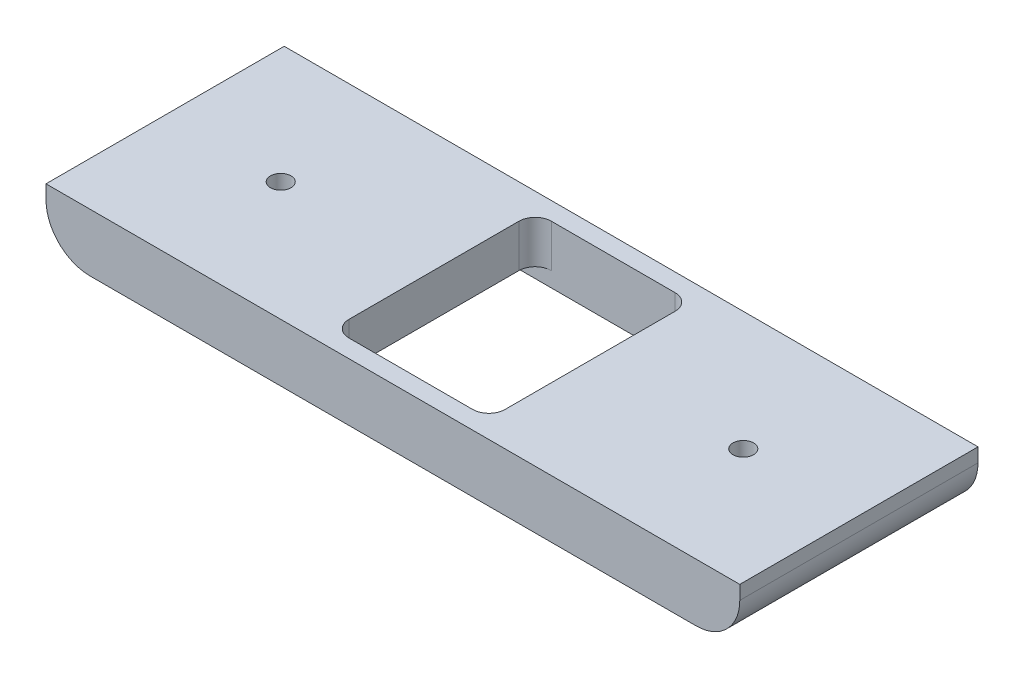
ISO-10303-21;
HEADER;
FILE_DESCRIPTION(('STEP AP214'),'2;1');
FILE_NAME('part.step','',(''),(''),'','','');
FILE_SCHEMA(('AUTOMOTIVE_DESIGN { 1 0 10303 214 1 1 1 1 }'));
ENDSEC;
DATA;
#1=APPLICATION_CONTEXT('core data for automotive mechanical design processes');
#2=APPLICATION_PROTOCOL_DEFINITION('international standard','automotive_design',2000,#1);
#3=PRODUCT_CONTEXT('',#1,'mechanical');
#4=PRODUCT('Part','Part','',(#3));
#5=PRODUCT_RELATED_PRODUCT_CATEGORY('part','',(#4));
#6=PRODUCT_DEFINITION_FORMATION('','',#4);
#7=PRODUCT_DEFINITION_CONTEXT('part definition',#1,'design');
#8=PRODUCT_DEFINITION('design','',#6,#7);
#9=PRODUCT_DEFINITION_SHAPE('','',#8);
#10=(LENGTH_UNIT() NAMED_UNIT(*) SI_UNIT(.MILLI.,.METRE.));
#11=(NAMED_UNIT(*) PLANE_ANGLE_UNIT() SI_UNIT($,.RADIAN.));
#12=(NAMED_UNIT(*) SI_UNIT($,.STERADIAN.) SOLID_ANGLE_UNIT());
#13=UNCERTAINTY_MEASURE_WITH_UNIT(LENGTH_MEASURE(1.E-05),#10,'distance_accuracy_value','');
#14=(GEOMETRIC_REPRESENTATION_CONTEXT(3) GLOBAL_UNCERTAINTY_ASSIGNED_CONTEXT((#13)) GLOBAL_UNIT_ASSIGNED_CONTEXT((#10,
#11,#12)) REPRESENTATION_CONTEXT('',''));
#15=CARTESIAN_POINT('',(0.,0.,0.));
#16=DIRECTION('',(0.,0.,1.));
#17=DIRECTION('',(1.,0.,0.));
#18=AXIS2_PLACEMENT_3D('',#15,#16,#17);
#19=CARTESIAN_POINT('',(-38.1,1.651,11.1125));
#20=DIRECTION('',(0.,1.,0.));
#21=DIRECTION('',(0.,0.,1.));
#22=AXIS2_PLACEMENT_3D('',#19,#20,#21);
#23=PLANE('',#22);
#24=CARTESIAN_POINT('',(-25.4,1.651,0.));
#25=DIRECTION('',(0.,1.,0.));
#26=DIRECTION('',(0.,0.,1.));
#27=AXIS2_PLACEMENT_3D('',#24,#25,#26);
#28=CIRCLE('',#27,1.13029999999999);
#29=CARTESIAN_POINT('',(-25.4,1.651,1.1303));
#30=VERTEX_POINT('',#29);
#31=EDGE_CURVE('E564',#30,#30,#28,.T.);
#32=ORIENTED_EDGE('',*,*,#31,.T.);
#33=EDGE_LOOP('',(#32));
#34=FACE_BOUND('',#33,.T.);
#35=DIRECTION('',(1.,0.,0.));
#36=VECTOR('',#35,1.);
#37=CARTESIAN_POINT('',(-38.1,1.651,-11.1125));
#38=LINE('',#37,#36);
#39=CARTESIAN_POINT('',(-36.9085083573986,1.651,-11.1125));
#40=VERTEX_POINT('',#39);
#41=CARTESIAN_POINT('',(-6.7945,1.651,-11.1125));
#42=VERTEX_POINT('',#41);
#43=EDGE_CURVE('E229',#40,#42,#38,.T.);
#44=ORIENTED_EDGE('',*,*,#43,.T.);
#45=CARTESIAN_POINT('',(-6.7945,1.651,-9.3345));
#46=DIRECTION('',(0.,1.,0.));
#47=DIRECTION('',(0.,0.,1.));
#48=AXIS2_PLACEMENT_3D('',#45,#46,#47);
#49=CIRCLE('',#48,1.778);
#50=CARTESIAN_POINT('',(-8.57250000000001,1.651,-9.3345));
#51=VERTEX_POINT('',#50);
#52=EDGE_CURVE('E202',#42,#51,#49,.T.);
#53=ORIENTED_EDGE('',*,*,#52,.T.);
#54=DIRECTION('',(0.,0.,1.));
#55=VECTOR('',#54,1.);
#56=CARTESIAN_POINT('',(-8.5725,1.651,11.1125));
#57=LINE('',#56,#55);
#58=CARTESIAN_POINT('',(-8.5725,1.651,9.3345));
#59=VERTEX_POINT('',#58);
#60=EDGE_CURVE('E12',#51,#59,#57,.T.);
#61=ORIENTED_EDGE('',*,*,#60,.T.);
#62=CARTESIAN_POINT('',(-6.7945,1.651,9.3345));
#63=DIRECTION('',(0.,1.,0.));
#64=DIRECTION('',(0.,0.,1.));
#65=AXIS2_PLACEMENT_3D('',#62,#63,#64);
#66=CIRCLE('',#65,1.778);
#67=CARTESIAN_POINT('',(-6.7945,1.651,11.1125));
#68=VERTEX_POINT('',#67);
#69=EDGE_CURVE('E45',#59,#68,#66,.T.);
#70=ORIENTED_EDGE('',*,*,#69,.T.);
#71=DIRECTION('',(1.,0.,0.));
#72=VECTOR('',#71,1.);
#73=CARTESIAN_POINT('',(-38.1,1.651,11.1125));
#74=LINE('',#73,#72);
#75=CARTESIAN_POINT('',(-36.9085083573986,1.651,11.1125));
#76=VERTEX_POINT('',#75);
#77=EDGE_CURVE('E225',#76,#68,#74,.T.);
#78=ORIENTED_EDGE('',*,*,#77,.F.);
#79=DIRECTION('',(0.,0.,1.));
#80=VECTOR('',#79,1.);
#81=CARTESIAN_POINT('',(-36.9085083573986,1.651,-13.081));
#82=LINE('',#81,#80);
#83=EDGE_CURVE('E293',#76,#40,#82,.F.);
#84=ORIENTED_EDGE('',*,*,#83,.T.);
#85=EDGE_LOOP('',(#44,#53,#61,#70,#78,#84));
#86=FACE_BOUND('',#85,.T.);
#87=ADVANCED_FACE('F36',(#34,#86),#23,.F.);
#88=CARTESIAN_POINT('',(38.1,0.,13.081));
#89=DIRECTION('',(0.,1.,0.));
#90=DIRECTION('',(0.,0.,1.));
#91=AXIS2_PLACEMENT_3D('',#88,#89,#90);
#92=PLANE('',#91);
#93=DIRECTION('',(0.,0.,1.));
#94=VECTOR('',#93,1.);
#95=CARTESIAN_POINT('',(-33.274,0.,13.081));
#96=LINE('',#95,#94);
#97=CARTESIAN_POINT('',(-33.274,0.,13.081));
#98=VERTEX_POINT('',#97);
#99=CARTESIAN_POINT('',(-33.274,0.,11.1125));
#100=VERTEX_POINT('',#99);
#101=EDGE_CURVE('E277',#98,#100,#96,.F.);
#102=ORIENTED_EDGE('',*,*,#101,.T.);
#103=DIRECTION('',(1.,0.,0.));
#104=VECTOR('',#103,1.);
#105=CARTESIAN_POINT('',(-38.1,0.,11.1125));
#106=LINE('',#105,#104);
#107=CARTESIAN_POINT('',(33.274,0.,11.1125));
#108=VERTEX_POINT('',#107);
#109=EDGE_CURVE('E222',#100,#108,#106,.T.);
#110=ORIENTED_EDGE('',*,*,#109,.T.);
#111=DIRECTION('',(0.,0.,-1.));
#112=VECTOR('',#111,1.);
#113=CARTESIAN_POINT('',(33.274,0.,13.081));
#114=LINE('',#113,#112);
#115=CARTESIAN_POINT('',(33.274,0.,13.081));
#116=VERTEX_POINT('',#115);
#117=EDGE_CURVE('E280',#108,#116,#114,.F.);
#118=ORIENTED_EDGE('',*,*,#117,.T.);
#119=DIRECTION('',(1.,0.,0.));
#120=VECTOR('',#119,1.);
#121=CARTESIAN_POINT('',(-38.1,0.,13.081));
#122=LINE('',#121,#120);
#123=EDGE_CURVE('E247',#98,#116,#122,.T.);
#124=ORIENTED_EDGE('',*,*,#123,.F.);
#125=EDGE_LOOP('',(#102,#110,#118,#124));
#126=FACE_BOUND('',#125,.T.);
#127=ADVANCED_FACE('F318',(#126),#92,.F.);
#128=CARTESIAN_POINT('',(38.1,6.35,-13.081));
#129=DIRECTION('',(-1.,0.,0.));
#130=DIRECTION('',(0.,0.,1.));
#131=AXIS2_PLACEMENT_3D('',#128,#129,#130);
#132=PLANE('',#131);
#133=DIRECTION('',(0.,-1.,0.));
#134=VECTOR('',#133,1.);
#135=CARTESIAN_POINT('',(38.1,6.35,13.081));
#136=LINE('',#135,#134);
#137=CARTESIAN_POINT('',(38.1,6.35,13.081));
#138=VERTEX_POINT('',#137);
#139=CARTESIAN_POINT('',(38.1,4.826,13.081));
#140=VERTEX_POINT('',#139);
#141=EDGE_CURVE('E253',#138,#140,#136,.T.);
#142=ORIENTED_EDGE('',*,*,#141,.T.);
#143=DIRECTION('',(0.,0.,-1.));
#144=VECTOR('',#143,1.);
#145=CARTESIAN_POINT('',(38.1,4.826,-13.081));
#146=LINE('',#145,#144);
#147=CARTESIAN_POINT('',(38.1,4.826,-13.081));
#148=VERTEX_POINT('',#147);
#149=EDGE_CURVE('E269',#140,#148,#146,.T.);
#150=ORIENTED_EDGE('',*,*,#149,.T.);
#151=DIRECTION('',(0.,-1.,0.));
#152=VECTOR('',#151,1.);
#153=CARTESIAN_POINT('',(38.1,6.35,-13.081));
#154=LINE('',#153,#152);
#155=CARTESIAN_POINT('',(38.1,6.35,-13.081));
#156=VERTEX_POINT('',#155);
#157=EDGE_CURVE('E266',#156,#148,#154,.T.);
#158=ORIENTED_EDGE('',*,*,#157,.F.);
#159=DIRECTION('',(0.,0.,-1.));
#160=VECTOR('',#159,1.);
#161=CARTESIAN_POINT('',(38.1,6.35,-13.081));
#162=LINE('',#161,#160);
#163=EDGE_CURVE('E243',#138,#156,#162,.T.);
#164=ORIENTED_EDGE('',*,*,#163,.F.);
#165=EDGE_LOOP('',(#142,#150,#158,#164));
#166=FACE_BOUND('',#165,.T.);
#167=ADVANCED_FACE('F331',(#166),#132,.F.);
#168=CARTESIAN_POINT('',(-38.1,6.35,-13.081));
#169=DIRECTION('',(0.,0.,1.));
#170=DIRECTION('',(1.,0.,0.));
#171=AXIS2_PLACEMENT_3D('',#168,#169,#170);
#172=PLANE('',#171);
#173=ORIENTED_EDGE('',*,*,#157,.T.);
#174=CARTESIAN_POINT('',(33.274,4.826,-13.081));
#175=DIRECTION('',(0.,0.,1.));
#176=DIRECTION('',(1.,0.,0.));
#177=AXIS2_PLACEMENT_3D('',#174,#175,#176);
#178=CIRCLE('',#177,4.826);
#179=CARTESIAN_POINT('',(33.274,0.,-13.081));
#180=VERTEX_POINT('',#179);
#181=EDGE_CURVE('E274',#148,#180,#178,.F.);
#182=ORIENTED_EDGE('',*,*,#181,.T.);
#183=DIRECTION('',(-1.,0.,0.));
#184=VECTOR('',#183,1.);
#185=CARTESIAN_POINT('',(-38.1,0.,-13.081));
#186=LINE('',#185,#184);
#187=CARTESIAN_POINT('',(-33.274,0.,-13.081));
#188=VERTEX_POINT('',#187);
#189=EDGE_CURVE('E242',#180,#188,#186,.T.);
#190=ORIENTED_EDGE('',*,*,#189,.T.);
#191=CARTESIAN_POINT('',(-33.274,4.826,-13.081));
#192=DIRECTION('',(0.,0.,1.));
#193=DIRECTION('',(1.,0.,0.));
#194=AXIS2_PLACEMENT_3D('',#191,#192,#193);
#195=CIRCLE('',#194,4.826);
#196=CARTESIAN_POINT('',(-38.1,4.826,-13.081));
#197=VERTEX_POINT('',#196);
#198=EDGE_CURVE('E272',#188,#197,#195,.F.);
#199=ORIENTED_EDGE('',*,*,#198,.T.);
#200=DIRECTION('',(0.,-1.,0.));
#201=VECTOR('',#200,1.);
#202=CARTESIAN_POINT('',(-38.1,6.35,-13.081));
#203=LINE('',#202,#201);
#204=CARTESIAN_POINT('',(-38.1,6.35,-13.081));
#205=VERTEX_POINT('',#204);
#206=EDGE_CURVE('E263',#205,#197,#203,.T.);
#207=ORIENTED_EDGE('',*,*,#206,.F.);
#208=DIRECTION('',(-1.,0.,0.));
#209=VECTOR('',#208,1.);
#210=CARTESIAN_POINT('',(-38.1,6.35,-13.081));
#211=LINE('',#210,#209);
#212=EDGE_CURVE('E246',#156,#205,#211,.T.);
#213=ORIENTED_EDGE('',*,*,#212,.F.);
#214=EDGE_LOOP('',(#173,#182,#190,#199,#207,#213));
#215=FACE_BOUND('',#214,.T.);
#216=ADVANCED_FACE('F334',(#215),#172,.F.);
#217=CARTESIAN_POINT('',(-38.1,6.35,-13.081));
#218=DIRECTION('',(1.,0.,0.));
#219=DIRECTION('',(0.,0.,-1.));
#220=AXIS2_PLACEMENT_3D('',#217,#218,#219);
#221=PLANE('',#220);
#222=ORIENTED_EDGE('',*,*,#206,.T.);
#223=DIRECTION('',(0.,0.,1.));
#224=VECTOR('',#223,1.);
#225=CARTESIAN_POINT('',(-38.1,4.826,-13.081));
#226=LINE('',#225,#224);
#227=CARTESIAN_POINT('',(-38.1,4.826,13.081));
#228=VERTEX_POINT('',#227);
#229=EDGE_CURVE('E288',#197,#228,#226,.T.);
#230=ORIENTED_EDGE('',*,*,#229,.T.);
#231=DIRECTION('',(0.,-1.,0.));
#232=VECTOR('',#231,1.);
#233=CARTESIAN_POINT('',(-38.1,6.35,13.081));
#234=LINE('',#233,#232);
#235=CARTESIAN_POINT('',(-38.1,6.35,13.081));
#236=VERTEX_POINT('',#235);
#237=EDGE_CURVE('E260',#236,#228,#234,.T.);
#238=ORIENTED_EDGE('',*,*,#237,.F.);
#239=DIRECTION('',(0.,0.,1.));
#240=VECTOR('',#239,1.);
#241=CARTESIAN_POINT('',(-38.1,6.35,-13.081));
#242=LINE('',#241,#240);
#243=EDGE_CURVE('E249',#205,#236,#242,.T.);
#244=ORIENTED_EDGE('',*,*,#243,.F.);
#245=EDGE_LOOP('',(#222,#230,#238,#244));
#246=FACE_BOUND('',#245,.T.);
#247=ADVANCED_FACE('F341',(#246),#221,.F.);
#248=CARTESIAN_POINT('',(-38.1,6.35,13.081));
#249=DIRECTION('',(0.,0.,-1.));
#250=DIRECTION('',(-1.,0.,0.));
#251=AXIS2_PLACEMENT_3D('',#248,#249,#250);
#252=PLANE('',#251);
#253=ORIENTED_EDGE('',*,*,#123,.T.);
#254=CARTESIAN_POINT('',(33.274,4.826,13.081));
#255=DIRECTION('',(0.,0.,-1.));
#256=DIRECTION('',(-1.,0.,0.));
#257=AXIS2_PLACEMENT_3D('',#254,#255,#256);
#258=CIRCLE('',#257,4.826);
#259=EDGE_CURVE('E286',#116,#140,#258,.F.);
#260=ORIENTED_EDGE('',*,*,#259,.T.);
#261=ORIENTED_EDGE('',*,*,#141,.F.);
#262=DIRECTION('',(1.,0.,0.));
#263=VECTOR('',#262,1.);
#264=CARTESIAN_POINT('',(-38.1,6.35,13.081));
#265=LINE('',#264,#263);
#266=EDGE_CURVE('E251',#236,#138,#265,.T.);
#267=ORIENTED_EDGE('',*,*,#266,.F.);
#268=ORIENTED_EDGE('',*,*,#237,.T.);
#269=CARTESIAN_POINT('',(-33.274,4.826,13.081));
#270=DIRECTION('',(0.,0.,-1.));
#271=DIRECTION('',(-1.,0.,0.));
#272=AXIS2_PLACEMENT_3D('',#269,#270,#271);
#273=CIRCLE('',#272,4.826);
#274=EDGE_CURVE('E284',#228,#98,#273,.F.);
#275=ORIENTED_EDGE('',*,*,#274,.T.);
#276=EDGE_LOOP('',(#253,#260,#261,#267,#268,#275));
#277=FACE_BOUND('',#276,.T.);
#278=ADVANCED_FACE('F322',(#277),#252,.F.);
#279=CARTESIAN_POINT('',(38.1,6.35,13.081));
#280=DIRECTION('',(0.,1.,0.));
#281=DIRECTION('',(0.,0.,1.));
#282=AXIS2_PLACEMENT_3D('',#279,#280,#281);
#283=PLANE('',#282);
#284=CARTESIAN_POINT('',(-25.4,6.35,0.));
#285=DIRECTION('',(0.,1.,0.));
#286=DIRECTION('',(0.,0.,1.));
#287=AXIS2_PLACEMENT_3D('',#284,#285,#286);
#288=CIRCLE('',#287,1.13029999999999);
#289=CARTESIAN_POINT('',(-25.4,6.35,1.13029999999999));
#290=VERTEX_POINT('',#289);
#291=EDGE_CURVE('E562',#290,#290,#288,.T.);
#292=ORIENTED_EDGE('',*,*,#291,.F.);
#293=EDGE_LOOP('',(#292));
#294=FACE_BOUND('',#293,.T.);
#295=CARTESIAN_POINT('',(25.4,6.35,0.));
#296=DIRECTION('',(0.,1.,0.));
#297=DIRECTION('',(0.,0.,1.));
#298=AXIS2_PLACEMENT_3D('',#295,#296,#297);
#299=CIRCLE('',#298,1.13029999999999);
#300=CARTESIAN_POINT('',(25.4,6.35,1.13029999999999));
#301=VERTEX_POINT('',#300);
#302=EDGE_CURVE('E183',#301,#301,#299,.T.);
#303=ORIENTED_EDGE('',*,*,#302,.F.);
#304=EDGE_LOOP('',(#303));
#305=FACE_BOUND('',#304,.T.);
#306=CARTESIAN_POINT('',(6.7945,6.35,-9.3345));
#307=DIRECTION('',(0.,-1.,0.));
#308=DIRECTION('',(0.,0.,-1.));
#309=AXIS2_PLACEMENT_3D('',#306,#307,#308);
#310=CIRCLE('',#309,1.778);
#311=CARTESIAN_POINT('',(6.7945,6.35,-11.1125));
#312=VERTEX_POINT('',#311);
#313=CARTESIAN_POINT('',(8.5725,6.35,-9.3345));
#314=VERTEX_POINT('',#313);
#315=EDGE_CURVE('E164',#312,#314,#310,.T.);
#316=ORIENTED_EDGE('',*,*,#315,.T.);
#317=DIRECTION('',(0.,0.,1.));
#318=VECTOR('',#317,1.);
#319=CARTESIAN_POINT('',(8.5725,6.35,9.3345));
#320=LINE('',#319,#318);
#321=CARTESIAN_POINT('',(8.5725,6.35,9.3345));
#322=VERTEX_POINT('',#321);
#323=EDGE_CURVE('E173',#314,#322,#320,.T.);
#324=ORIENTED_EDGE('',*,*,#323,.T.);
#325=CARTESIAN_POINT('',(6.7945,6.35,9.3345));
#326=DIRECTION('',(0.,-1.,0.));
#327=DIRECTION('',(0.,0.,-1.));
#328=AXIS2_PLACEMENT_3D('',#325,#326,#327);
#329=CIRCLE('',#328,1.778);
#330=CARTESIAN_POINT('',(6.7945,6.35,11.1125));
#331=VERTEX_POINT('',#330);
#332=EDGE_CURVE('E52',#322,#331,#329,.T.);
#333=ORIENTED_EDGE('',*,*,#332,.T.);
#334=DIRECTION('',(-1.,0.,0.));
#335=VECTOR('',#334,1.);
#336=CARTESIAN_POINT('',(-6.7945,6.35,11.1125));
#337=LINE('',#336,#335);
#338=CARTESIAN_POINT('',(-6.7945,6.35,11.1125));
#339=VERTEX_POINT('',#338);
#340=EDGE_CURVE('E188',#331,#339,#337,.T.);
#341=ORIENTED_EDGE('',*,*,#340,.T.);
#342=CARTESIAN_POINT('',(-6.7945,6.35,9.3345));
#343=DIRECTION('',(0.,-1.,0.));
#344=DIRECTION('',(0.,0.,-1.));
#345=AXIS2_PLACEMENT_3D('',#342,#343,#344);
#346=CIRCLE('',#345,1.778);
#347=CARTESIAN_POINT('',(-8.5725,6.35,9.3345));
#348=VERTEX_POINT('',#347);
#349=EDGE_CURVE('E191',#339,#348,#346,.T.);
#350=ORIENTED_EDGE('',*,*,#349,.T.);
#351=DIRECTION('',(0.,0.,-1.));
#352=VECTOR('',#351,1.);
#353=CARTESIAN_POINT('',(-8.5725,6.35,-9.3345));
#354=LINE('',#353,#352);
#355=CARTESIAN_POINT('',(-8.57250000000001,6.35,-9.3345));
#356=VERTEX_POINT('',#355);
#357=EDGE_CURVE('E194',#348,#356,#354,.T.);
#358=ORIENTED_EDGE('',*,*,#357,.T.);
#359=CARTESIAN_POINT('',(-6.7945,6.35,-9.3345));
#360=DIRECTION('',(0.,-1.,0.));
#361=DIRECTION('',(0.,0.,-1.));
#362=AXIS2_PLACEMENT_3D('',#359,#360,#361);
#363=CIRCLE('',#362,1.778);
#364=CARTESIAN_POINT('',(-6.7945,6.35,-11.1125));
#365=VERTEX_POINT('',#364);
#366=EDGE_CURVE('E197',#356,#365,#363,.T.);
#367=ORIENTED_EDGE('',*,*,#366,.T.);
#368=DIRECTION('',(1.,0.,0.));
#369=VECTOR('',#368,1.);
#370=CARTESIAN_POINT('',(6.7945,6.35,-11.1125));
#371=LINE('',#370,#369);
#372=EDGE_CURVE('E170',#365,#312,#371,.T.);
#373=ORIENTED_EDGE('',*,*,#372,.T.);
#374=EDGE_LOOP('',(#316,#324,#333,#341,#350,#358,#367,#373));
#375=FACE_BOUND('',#374,.T.);
#376=ORIENTED_EDGE('',*,*,#163,.T.);
#377=ORIENTED_EDGE('',*,*,#212,.T.);
#378=ORIENTED_EDGE('',*,*,#243,.T.);
#379=ORIENTED_EDGE('',*,*,#266,.T.);
#380=EDGE_LOOP('',(#376,#377,#378,#379));
#381=FACE_BOUND('',#380,.T.);
#382=ADVANCED_FACE('F177',(#294,#305,#375,#381),#283,.T.);
#383=CARTESIAN_POINT('',(33.274,0.,-11.1125));
#384=VERTEX_POINT('',#383);
#385=EDGE_CURVE('E281',#180,#384,#114,.F.);
#386=ORIENTED_EDGE('',*,*,#385,.T.);
#387=DIRECTION('',(1.,0.,0.));
#388=VECTOR('',#387,1.);
#389=CARTESIAN_POINT('',(-38.1,0.,-11.1125));
#390=LINE('',#389,#388);
#391=CARTESIAN_POINT('',(-33.274,0.,-11.1125));
#392=VERTEX_POINT('',#391);
#393=EDGE_CURVE('E221',#392,#384,#390,.T.);
#394=ORIENTED_EDGE('',*,*,#393,.F.);
#395=EDGE_CURVE('E276',#392,#188,#96,.F.);
#396=ORIENTED_EDGE('',*,*,#395,.T.);
#397=ORIENTED_EDGE('',*,*,#189,.F.);
#398=EDGE_LOOP('',(#386,#394,#396,#397));
#399=FACE_BOUND('',#398,.T.);
#400=ADVANCED_FACE('F346',(#399),#92,.F.);
#401=CARTESIAN_POINT('',(33.274,4.826,-13.081));
#402=DIRECTION('',(0.,0.,-1.));
#403=DIRECTION('',(-1.,0.,0.));
#404=AXIS2_PLACEMENT_3D('',#401,#402,#403);
#405=CYLINDRICAL_SURFACE('',#404,4.826);
#406=CARTESIAN_POINT('',(33.274,4.826,11.1125));
#407=DIRECTION('',(0.,0.,1.));
#408=DIRECTION('',(0.,-1.,0.));
#409=AXIS2_PLACEMENT_3D('',#406,#407,#408);
#410=CIRCLE('',#409,4.826);
#411=CARTESIAN_POINT('',(36.9085083573985,1.651,11.1125));
#412=VERTEX_POINT('',#411);
#413=EDGE_CURVE('E239',#412,#108,#410,.F.);
#414=ORIENTED_EDGE('',*,*,#413,.F.);
#415=DIRECTION('',(0.,0.,-1.));
#416=VECTOR('',#415,1.);
#417=CARTESIAN_POINT('',(36.9085083573986,1.651,-13.081));
#418=LINE('',#417,#416);
#419=CARTESIAN_POINT('',(36.9085083573986,1.651,-11.1125));
#420=VERTEX_POINT('',#419);
#421=EDGE_CURVE('E236',#420,#412,#418,.F.);
#422=ORIENTED_EDGE('',*,*,#421,.F.);
#423=CARTESIAN_POINT('',(33.274,4.826,-11.1125));
#424=DIRECTION('',(0.,0.,-1.));
#425=DIRECTION('',(0.,1.,0.));
#426=AXIS2_PLACEMENT_3D('',#423,#424,#425);
#427=CIRCLE('',#426,4.826);
#428=EDGE_CURVE('E224',#384,#420,#427,.F.);
#429=ORIENTED_EDGE('',*,*,#428,.F.);
#430=ORIENTED_EDGE('',*,*,#385,.F.);
#431=ORIENTED_EDGE('',*,*,#181,.F.);
#432=ORIENTED_EDGE('',*,*,#149,.F.);
#433=ORIENTED_EDGE('',*,*,#259,.F.);
#434=ORIENTED_EDGE('',*,*,#117,.F.);
#435=EDGE_LOOP('',(#414,#422,#429,#430,#431,#432,#433,#434));
#436=FACE_BOUND('',#435,.T.);
#437=ADVANCED_FACE('F327',(#436),#405,.T.);
#438=CARTESIAN_POINT('',(-33.274,4.826,-13.081));
#439=DIRECTION('',(0.,0.,1.));
#440=DIRECTION('',(1.,0.,0.));
#441=AXIS2_PLACEMENT_3D('',#438,#439,#440);
#442=CYLINDRICAL_SURFACE('',#441,4.826);
#443=CARTESIAN_POINT('',(-33.274,4.826,11.1125));
#444=DIRECTION('',(0.,0.,1.));
#445=DIRECTION('',(0.,-1.,0.));
#446=AXIS2_PLACEMENT_3D('',#443,#444,#445);
#447=CIRCLE('',#446,4.826);
#448=EDGE_CURVE('E296',#100,#76,#447,.F.);
#449=ORIENTED_EDGE('',*,*,#448,.F.);
#450=ORIENTED_EDGE('',*,*,#101,.F.);
#451=ORIENTED_EDGE('',*,*,#274,.F.);
#452=ORIENTED_EDGE('',*,*,#229,.F.);
#453=ORIENTED_EDGE('',*,*,#198,.F.);
#454=ORIENTED_EDGE('',*,*,#395,.F.);
#455=CARTESIAN_POINT('',(-33.274,4.826,-11.1125));
#456=DIRECTION('',(0.,0.,-1.));
#457=DIRECTION('',(0.,1.,0.));
#458=AXIS2_PLACEMENT_3D('',#455,#456,#457);
#459=CIRCLE('',#458,4.826);
#460=EDGE_CURVE('E291',#40,#392,#459,.F.);
#461=ORIENTED_EDGE('',*,*,#460,.F.);
#462=ORIENTED_EDGE('',*,*,#83,.F.);
#463=EDGE_LOOP('',(#449,#450,#451,#452,#453,#454,#461,#462));
#464=FACE_BOUND('',#463,.T.);
#465=ADVANCED_FACE('F38',(#464),#442,.T.);
#466=CARTESIAN_POINT('',(-38.1,0.,11.1125));
#467=DIRECTION('',(0.,0.,1.));
#468=DIRECTION('',(0.,-1.,0.));
#469=AXIS2_PLACEMENT_3D('',#466,#467,#468);
#470=PLANE('',#469);
#471=ORIENTED_EDGE('',*,*,#77,.T.);
#472=DIRECTION('',(0.,-1.,0.));
#473=VECTOR('',#472,1.);
#474=CARTESIAN_POINT('',(-6.7945,6.35,11.1125));
#475=LINE('',#474,#473);
#476=EDGE_CURVE('E212',#339,#68,#475,.T.);
#477=ORIENTED_EDGE('',*,*,#476,.F.);
#478=ORIENTED_EDGE('',*,*,#340,.F.);
#479=DIRECTION('',(0.,-1.,0.));
#480=VECTOR('',#479,1.);
#481=CARTESIAN_POINT('',(6.7945,6.35,11.1125));
#482=LINE('',#481,#480);
#483=CARTESIAN_POINT('',(6.7945,1.651,11.1125));
#484=VERTEX_POINT('',#483);
#485=EDGE_CURVE('E214',#331,#484,#482,.T.);
#486=ORIENTED_EDGE('',*,*,#485,.T.);
#487=EDGE_CURVE('E228',#484,#412,#74,.T.);
#488=ORIENTED_EDGE('',*,*,#487,.T.);
#489=ORIENTED_EDGE('',*,*,#413,.T.);
#490=ORIENTED_EDGE('',*,*,#109,.F.);
#491=ORIENTED_EDGE('',*,*,#448,.T.);
#492=EDGE_LOOP('',(#471,#477,#478,#486,#488,#489,#490,#491));
#493=FACE_BOUND('',#492,.T.);
#494=ADVANCED_FACE('F309',(#493),#470,.F.);
#495=CARTESIAN_POINT('',(25.4,1.651,0.));
#496=DIRECTION('',(0.,1.,0.));
#497=DIRECTION('',(0.,0.,1.));
#498=AXIS2_PLACEMENT_3D('',#495,#496,#497);
#499=CIRCLE('',#498,1.13029999999999);
#500=CARTESIAN_POINT('',(25.4,1.651,1.1303));
#501=VERTEX_POINT('',#500);
#502=EDGE_CURVE('E40',#501,#501,#499,.T.);
#503=ORIENTED_EDGE('',*,*,#502,.T.);
#504=EDGE_LOOP('',(#503));
#505=FACE_BOUND('',#504,.T.);
#506=DIRECTION('',(0.,0.,-1.));
#507=VECTOR('',#506,1.);
#508=CARTESIAN_POINT('',(8.5725,1.651,11.1125));
#509=LINE('',#508,#507);
#510=CARTESIAN_POINT('',(8.5725,1.651,9.3345));
#511=VERTEX_POINT('',#510);
#512=CARTESIAN_POINT('',(8.5725,1.651,-9.33449999999999));
#513=VERTEX_POINT('',#512);
#514=EDGE_CURVE('E298',#511,#513,#509,.T.);
#515=ORIENTED_EDGE('',*,*,#514,.T.);
#516=CARTESIAN_POINT('',(6.7945,1.651,-9.3345));
#517=DIRECTION('',(0.,1.,0.));
#518=DIRECTION('',(0.,0.,1.));
#519=AXIS2_PLACEMENT_3D('',#516,#517,#518);
#520=CIRCLE('',#519,1.778);
#521=CARTESIAN_POINT('',(6.7945,1.651,-11.1125));
#522=VERTEX_POINT('',#521);
#523=EDGE_CURVE('E167',#513,#522,#520,.T.);
#524=ORIENTED_EDGE('',*,*,#523,.T.);
#525=EDGE_CURVE('E232',#522,#420,#38,.T.);
#526=ORIENTED_EDGE('',*,*,#525,.T.);
#527=ORIENTED_EDGE('',*,*,#421,.T.);
#528=ORIENTED_EDGE('',*,*,#487,.F.);
#529=CARTESIAN_POINT('',(6.7945,1.651,9.3345));
#530=DIRECTION('',(0.,1.,0.));
#531=DIRECTION('',(0.,0.,1.));
#532=AXIS2_PLACEMENT_3D('',#529,#530,#531);
#533=CIRCLE('',#532,1.778);
#534=EDGE_CURVE('E300',#484,#511,#533,.T.);
#535=ORIENTED_EDGE('',*,*,#534,.T.);
#536=EDGE_LOOP('',(#515,#524,#526,#527,#528,#535));
#537=FACE_BOUND('',#536,.T.);
#538=ADVANCED_FACE('F362',(#505,#537),#23,.F.);
#539=CARTESIAN_POINT('',(-38.1,1.651,-11.1125));
#540=DIRECTION('',(0.,0.,-1.));
#541=DIRECTION('',(0.,1.,0.));
#542=AXIS2_PLACEMENT_3D('',#539,#540,#541);
#543=PLANE('',#542);
#544=ORIENTED_EDGE('',*,*,#525,.F.);
#545=DIRECTION('',(0.,-1.,0.));
#546=VECTOR('',#545,1.);
#547=CARTESIAN_POINT('',(6.7945,6.35,-11.1125));
#548=LINE('',#547,#546);
#549=EDGE_CURVE('E200',#312,#522,#548,.T.);
#550=ORIENTED_EDGE('',*,*,#549,.F.);
#551=ORIENTED_EDGE('',*,*,#372,.F.);
#552=DIRECTION('',(0.,-1.,0.));
#553=VECTOR('',#552,1.);
#554=CARTESIAN_POINT('',(-6.7945,6.35,-11.1125));
#555=LINE('',#554,#553);
#556=EDGE_CURVE('E203',#365,#42,#555,.T.);
#557=ORIENTED_EDGE('',*,*,#556,.T.);
#558=ORIENTED_EDGE('',*,*,#43,.F.);
#559=ORIENTED_EDGE('',*,*,#460,.T.);
#560=ORIENTED_EDGE('',*,*,#393,.T.);
#561=ORIENTED_EDGE('',*,*,#428,.T.);
#562=EDGE_LOOP('',(#544,#550,#551,#557,#558,#559,#560,#561));
#563=FACE_BOUND('',#562,.T.);
#564=ADVANCED_FACE('F352',(#563),#543,.F.);
#565=CARTESIAN_POINT('',(-8.5725,6.35,-9.3345));
#566=DIRECTION('',(-1.,0.,0.));
#567=DIRECTION('',(0.,0.,1.));
#568=AXIS2_PLACEMENT_3D('',#565,#566,#567);
#569=PLANE('',#568);
#570=DIRECTION('',(0.,-1.,0.));
#571=VECTOR('',#570,1.);
#572=CARTESIAN_POINT('',(-8.57250000000001,6.35,-9.3345));
#573=LINE('',#572,#571);
#574=EDGE_CURVE('E206',#356,#51,#573,.T.);
#575=ORIENTED_EDGE('',*,*,#574,.F.);
#576=ORIENTED_EDGE('',*,*,#357,.F.);
#577=DIRECTION('',(0.,-1.,0.));
#578=VECTOR('',#577,1.);
#579=CARTESIAN_POINT('',(-8.5725,6.35,9.3345));
#580=LINE('',#579,#578);
#581=EDGE_CURVE('E209',#348,#59,#580,.T.);
#582=ORIENTED_EDGE('',*,*,#581,.T.);
#583=ORIENTED_EDGE('',*,*,#60,.F.);
#584=EDGE_LOOP('',(#575,#576,#582,#583));
#585=FACE_BOUND('',#584,.T.);
#586=ADVANCED_FACE('F358',(#585),#569,.F.);
#587=CARTESIAN_POINT('',(-6.7945,6.35,9.3345));
#588=DIRECTION('',(0.,-1.,0.));
#589=DIRECTION('',(0.,0.,-1.));
#590=AXIS2_PLACEMENT_3D('',#587,#588,#589);
#591=CYLINDRICAL_SURFACE('',#590,1.778);
#592=ORIENTED_EDGE('',*,*,#581,.F.);
#593=ORIENTED_EDGE('',*,*,#349,.F.);
#594=ORIENTED_EDGE('',*,*,#476,.T.);
#595=ORIENTED_EDGE('',*,*,#69,.F.);
#596=EDGE_LOOP('',(#592,#593,#594,#595));
#597=FACE_BOUND('',#596,.T.);
#598=ADVANCED_FACE('F359',(#597),#591,.F.);
#599=CARTESIAN_POINT('',(6.7945,6.35,9.3345));
#600=DIRECTION('',(0.,-1.,0.));
#601=DIRECTION('',(0.,0.,-1.));
#602=AXIS2_PLACEMENT_3D('',#599,#600,#601);
#603=CYLINDRICAL_SURFACE('',#602,1.778);
#604=ORIENTED_EDGE('',*,*,#485,.F.);
#605=ORIENTED_EDGE('',*,*,#332,.F.);
#606=DIRECTION('',(0.,-1.,0.));
#607=VECTOR('',#606,1.);
#608=CARTESIAN_POINT('',(8.5725,6.35,9.3345));
#609=LINE('',#608,#607);
#610=EDGE_CURVE('E169',#322,#511,#609,.T.);
#611=ORIENTED_EDGE('',*,*,#610,.T.);
#612=ORIENTED_EDGE('',*,*,#534,.F.);
#613=EDGE_LOOP('',(#604,#605,#611,#612));
#614=FACE_BOUND('',#613,.T.);
#615=ADVANCED_FACE('F363',(#614),#603,.F.);
#616=CARTESIAN_POINT('',(8.5725,6.35,9.3345));
#617=DIRECTION('',(1.,0.,0.));
#618=DIRECTION('',(0.,0.,-1.));
#619=AXIS2_PLACEMENT_3D('',#616,#617,#618);
#620=PLANE('',#619);
#621=ORIENTED_EDGE('',*,*,#610,.F.);
#622=ORIENTED_EDGE('',*,*,#323,.F.);
#623=DIRECTION('',(0.,-1.,0.));
#624=VECTOR('',#623,1.);
#625=CARTESIAN_POINT('',(8.5725,6.35,-9.3345));
#626=LINE('',#625,#624);
#627=EDGE_CURVE('E60',#314,#513,#626,.T.);
#628=ORIENTED_EDGE('',*,*,#627,.T.);
#629=ORIENTED_EDGE('',*,*,#514,.F.);
#630=EDGE_LOOP('',(#621,#622,#628,#629));
#631=FACE_BOUND('',#630,.T.);
#632=ADVANCED_FACE('F174',(#631),#620,.F.);
#633=CARTESIAN_POINT('',(6.7945,6.35,-9.3345));
#634=DIRECTION('',(0.,-1.,0.));
#635=DIRECTION('',(0.,0.,-1.));
#636=AXIS2_PLACEMENT_3D('',#633,#634,#635);
#637=CYLINDRICAL_SURFACE('',#636,1.778);
#638=ORIENTED_EDGE('',*,*,#627,.F.);
#639=ORIENTED_EDGE('',*,*,#315,.F.);
#640=ORIENTED_EDGE('',*,*,#549,.T.);
#641=ORIENTED_EDGE('',*,*,#523,.F.);
#642=EDGE_LOOP('',(#638,#639,#640,#641));
#643=FACE_BOUND('',#642,.T.);
#644=ADVANCED_FACE('F162',(#643),#637,.F.);
#645=CARTESIAN_POINT('',(-6.7945,6.35,-9.3345));
#646=DIRECTION('',(0.,-1.,0.));
#647=DIRECTION('',(0.,0.,-1.));
#648=AXIS2_PLACEMENT_3D('',#645,#646,#647);
#649=CYLINDRICAL_SURFACE('',#648,1.778);
#650=ORIENTED_EDGE('',*,*,#556,.F.);
#651=ORIENTED_EDGE('',*,*,#366,.F.);
#652=ORIENTED_EDGE('',*,*,#574,.T.);
#653=ORIENTED_EDGE('',*,*,#52,.F.);
#654=EDGE_LOOP('',(#650,#651,#652,#653));
#655=FACE_BOUND('',#654,.T.);
#656=ADVANCED_FACE('F354',(#655),#649,.F.);
#657=CARTESIAN_POINT('',(25.4,6.35,0.));
#658=DIRECTION('',(0.,1.,0.));
#659=DIRECTION('',(0.,0.,1.));
#660=AXIS2_PLACEMENT_3D('',#657,#658,#659);
#661=CYLINDRICAL_SURFACE('',#660,1.13029999999999);
#662=ORIENTED_EDGE('',*,*,#302,.T.);
#663=EDGE_LOOP('',(#662));
#664=FACE_BOUND('',#663,.T.);
#665=ORIENTED_EDGE('',*,*,#502,.F.);
#666=EDGE_LOOP('',(#665));
#667=FACE_BOUND('',#666,.T.);
#668=ADVANCED_FACE('F390',(#664,#667),#661,.F.);
#669=CARTESIAN_POINT('',(-25.4,6.35,0.));
#670=DIRECTION('',(0.,1.,0.));
#671=DIRECTION('',(0.,0.,1.));
#672=AXIS2_PLACEMENT_3D('',#669,#670,#671);
#673=CYLINDRICAL_SURFACE('',#672,1.13029999999999);
#674=ORIENTED_EDGE('',*,*,#291,.T.);
#675=EDGE_LOOP('',(#674));
#676=FACE_BOUND('',#675,.T.);
#677=ORIENTED_EDGE('',*,*,#31,.F.);
#678=EDGE_LOOP('',(#677));
#679=FACE_BOUND('',#678,.T.);
#680=ADVANCED_FACE('F392',(#676,#679),#673,.F.);
#681=CLOSED_SHELL('',(#87,#127,#167,#216,#247,#278,#382,#400,#437,#465,#494,#538,#564,#586,#598,
#615,#632,#644,#656,#668,#680));
#682=MANIFOLD_SOLID_BREP('B2',#681);
#683=ADVANCED_BREP_SHAPE_REPRESENTATION('',(#18,#682),#14);
#684=SHAPE_DEFINITION_REPRESENTATION(#9,#683);
ENDSEC;
END-ISO-10303-21;
